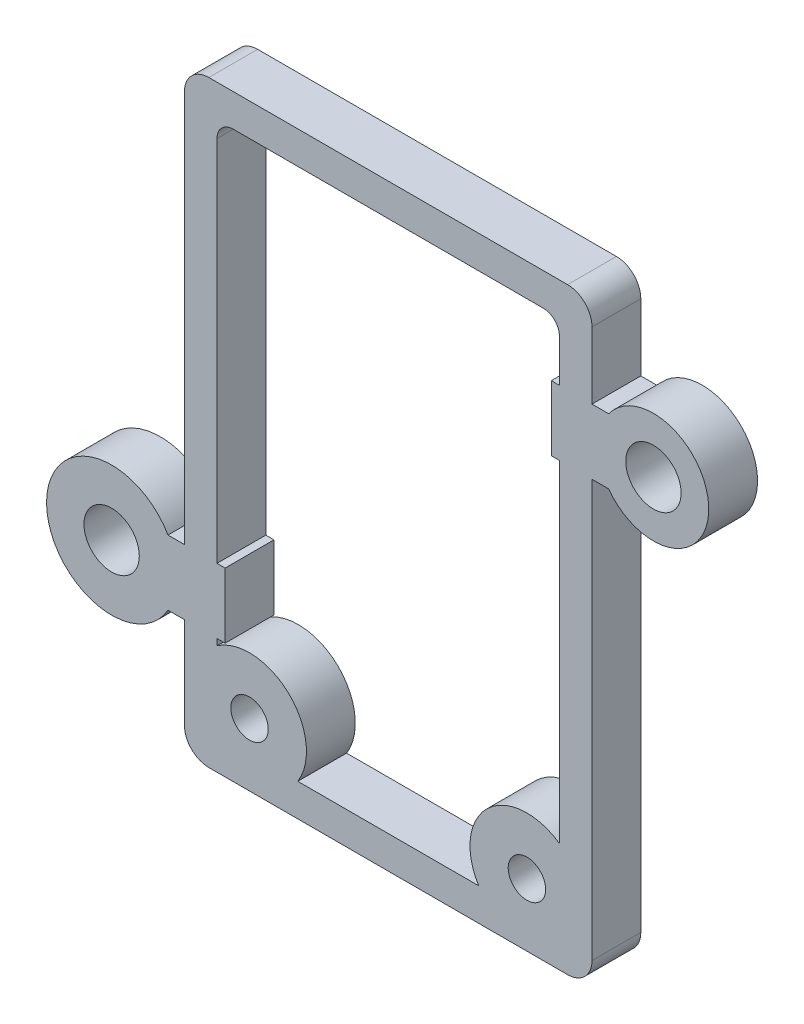
ISO-10303-21;
HEADER;
FILE_DESCRIPTION(('STEP AP214'),'2;1');
FILE_NAME('part.step','',(''),(''),'','','');
FILE_SCHEMA(('AUTOMOTIVE_DESIGN { 1 0 10303 214 1 1 1 1 }'));
ENDSEC;
DATA;
#1=APPLICATION_CONTEXT('core data for automotive mechanical design processes');
#2=APPLICATION_PROTOCOL_DEFINITION('international standard','automotive_design',2000,#1);
#3=PRODUCT_CONTEXT('',#1,'mechanical');
#4=PRODUCT('Part','Part','',(#3));
#5=PRODUCT_RELATED_PRODUCT_CATEGORY('part','',(#4));
#6=PRODUCT_DEFINITION_FORMATION('','',#4);
#7=PRODUCT_DEFINITION_CONTEXT('part definition',#1,'design');
#8=PRODUCT_DEFINITION('design','',#6,#7);
#9=PRODUCT_DEFINITION_SHAPE('','',#8);
#10=(LENGTH_UNIT() NAMED_UNIT(*) SI_UNIT(.MILLI.,.METRE.));
#11=(NAMED_UNIT(*) PLANE_ANGLE_UNIT() SI_UNIT($,.RADIAN.));
#12=(NAMED_UNIT(*) SI_UNIT($,.STERADIAN.) SOLID_ANGLE_UNIT());
#13=UNCERTAINTY_MEASURE_WITH_UNIT(LENGTH_MEASURE(1.E-05),#10,'distance_accuracy_value','');
#14=(GEOMETRIC_REPRESENTATION_CONTEXT(3) GLOBAL_UNCERTAINTY_ASSIGNED_CONTEXT((#13)) GLOBAL_UNIT_ASSIGNED_CONTEXT((#10,
#11,#12)) REPRESENTATION_CONTEXT('',''));
#15=CARTESIAN_POINT('',(0.,0.,0.));
#16=DIRECTION('',(0.,0.,1.));
#17=DIRECTION('',(1.,0.,0.));
#18=AXIS2_PLACEMENT_3D('',#15,#16,#17);
#19=CARTESIAN_POINT('',(-4.975,6.62,3.));
#20=DIRECTION('',(0.,1.,0.));
#21=DIRECTION('',(0.,0.,1.));
#22=AXIS2_PLACEMENT_3D('',#19,#20,#21);
#23=PLANE('',#22);
#24=DIRECTION('',(0.,0.,-1.));
#25=VECTOR('',#24,1.);
#26=CARTESIAN_POINT('',(-1.51089838486224,6.62,3.));
#27=LINE('',#26,#25);
#28=CARTESIAN_POINT('',(-1.51089838486224,6.62,0.));
#29=VERTEX_POINT('',#28);
#30=CARTESIAN_POINT('',(-1.51089838486224,6.62,3.));
#31=VERTEX_POINT('',#30);
#32=EDGE_CURVE('E61',#29,#31,#27,.F.);
#33=ORIENTED_EDGE('',*,*,#32,.F.);
#34=DIRECTION('',(1.,0.,0.));
#35=VECTOR('',#34,1.);
#36=CARTESIAN_POINT('',(-4.975,6.62,0.));
#37=LINE('',#36,#35);
#38=CARTESIAN_POINT('',(-0.5,6.62,0.));
#39=VERTEX_POINT('',#38);
#40=EDGE_CURVE('E298',#29,#39,#37,.T.);
#41=ORIENTED_EDGE('',*,*,#40,.T.);
#42=DIRECTION('',(0.,0.,1.));
#43=VECTOR('',#42,1.);
#44=CARTESIAN_POINT('',(-0.5,6.62,3.));
#45=LINE('',#44,#43);
#46=CARTESIAN_POINT('',(-0.5,6.62,3.));
#47=VERTEX_POINT('',#46);
#48=EDGE_CURVE('E479',#39,#47,#45,.T.);
#49=ORIENTED_EDGE('',*,*,#48,.T.);
#50=DIRECTION('',(1.,0.,0.));
#51=VECTOR('',#50,1.);
#52=CARTESIAN_POINT('',(-4.975,6.62,3.));
#53=LINE('',#52,#51);
#54=EDGE_CURVE('E59',#31,#47,#53,.T.);
#55=ORIENTED_EDGE('',*,*,#54,.F.);
#56=EDGE_LOOP('',(#33,#41,#49,#55));
#57=FACE_BOUND('',#56,.T.);
#58=ADVANCED_FACE('F43',(#57),#23,.F.);
#59=CARTESIAN_POINT('',(2.,10.62,3.));
#60=DIRECTION('',(0.,-1.,0.));
#61=DIRECTION('',(0.,0.,-1.));
#62=AXIS2_PLACEMENT_3D('',#59,#60,#61);
#63=PLANE('',#62);
#64=DIRECTION('',(0.,0.,-1.));
#65=VECTOR('',#64,1.);
#66=CARTESIAN_POINT('',(-1.51089838486225,10.62,3.));
#67=LINE('',#66,#65);
#68=CARTESIAN_POINT('',(-1.51089838486225,10.62,3.));
#69=VERTEX_POINT('',#68);
#70=CARTESIAN_POINT('',(-1.51089838486225,10.62,0.));
#71=VERTEX_POINT('',#70);
#72=EDGE_CURVE('E11',#69,#71,#67,.T.);
#73=ORIENTED_EDGE('',*,*,#72,.F.);
#74=DIRECTION('',(-1.,0.,0.));
#75=VECTOR('',#74,1.);
#76=CARTESIAN_POINT('',(2.,10.62,3.));
#77=LINE('',#76,#75);
#78=CARTESIAN_POINT('',(-0.5,10.62,3.));
#79=VERTEX_POINT('',#78);
#80=EDGE_CURVE('E293',#79,#69,#77,.T.);
#81=ORIENTED_EDGE('',*,*,#80,.F.);
#82=DIRECTION('',(0.,0.,-1.));
#83=VECTOR('',#82,1.);
#84=CARTESIAN_POINT('',(-0.5,10.62,3.));
#85=LINE('',#84,#83);
#86=CARTESIAN_POINT('',(-0.5,10.62,0.));
#87=VERTEX_POINT('',#86);
#88=EDGE_CURVE('E472',#79,#87,#85,.T.);
#89=ORIENTED_EDGE('',*,*,#88,.T.);
#90=DIRECTION('',(-1.,0.,0.));
#91=VECTOR('',#90,1.);
#92=CARTESIAN_POINT('',(2.,10.62,0.));
#93=LINE('',#92,#91);
#94=EDGE_CURVE('E301',#87,#71,#93,.T.);
#95=ORIENTED_EDGE('',*,*,#94,.T.);
#96=EDGE_LOOP('',(#73,#81,#89,#95));
#97=FACE_BOUND('',#96,.T.);
#98=ADVANCED_FACE('F530',(#97),#63,.F.);
#99=CARTESIAN_POINT('',(28.025,30.62,3.));
#100=DIRECTION('',(0.,-1.,0.));
#101=DIRECTION('',(0.,0.,-1.));
#102=AXIS2_PLACEMENT_3D('',#99,#100,#101);
#103=PLANE('',#102);
#104=DIRECTION('',(0.,0.,-1.));
#105=VECTOR('',#104,1.);
#106=CARTESIAN_POINT('',(25.5754545830265,30.62,3.));
#107=LINE('',#106,#105);
#108=CARTESIAN_POINT('',(25.5754545830265,30.62,0.));
#109=VERTEX_POINT('',#108);
#110=CARTESIAN_POINT('',(25.5754545830265,30.62,3.));
#111=VERTEX_POINT('',#110);
#112=EDGE_CURVE('E284',#109,#111,#107,.F.);
#113=ORIENTED_EDGE('',*,*,#112,.F.);
#114=DIRECTION('',(-1.,0.,0.));
#115=VECTOR('',#114,1.);
#116=CARTESIAN_POINT('',(28.025,30.62,0.));
#117=LINE('',#116,#115);
#118=CARTESIAN_POINT('',(24.55,30.62,0.));
#119=VERTEX_POINT('',#118);
#120=EDGE_CURVE('E257',#109,#119,#117,.T.);
#121=ORIENTED_EDGE('',*,*,#120,.T.);
#122=DIRECTION('',(0.,0.,1.));
#123=VECTOR('',#122,1.);
#124=CARTESIAN_POINT('',(24.55,30.62,3.));
#125=LINE('',#124,#123);
#126=CARTESIAN_POINT('',(24.55,30.62,3.));
#127=VERTEX_POINT('',#126);
#128=EDGE_CURVE('E480',#119,#127,#125,.T.);
#129=ORIENTED_EDGE('',*,*,#128,.T.);
#130=DIRECTION('',(-1.,0.,0.));
#131=VECTOR('',#130,1.);
#132=CARTESIAN_POINT('',(28.025,30.62,3.));
#133=LINE('',#132,#131);
#134=EDGE_CURVE('E324',#111,#127,#133,.T.);
#135=ORIENTED_EDGE('',*,*,#134,.F.);
#136=EDGE_LOOP('',(#113,#121,#129,#135));
#137=FACE_BOUND('',#136,.T.);
#138=ADVANCED_FACE('F485',(#137),#103,.F.);
#139=CARTESIAN_POINT('',(22.05,26.62,3.));
#140=DIRECTION('',(0.,1.,0.));
#141=DIRECTION('',(0.,0.,1.));
#142=AXIS2_PLACEMENT_3D('',#139,#140,#141);
#143=PLANE('',#142);
#144=DIRECTION('',(0.,0.,-1.));
#145=VECTOR('',#144,1.);
#146=CARTESIAN_POINT('',(25.5754545830265,26.62,3.));
#147=LINE('',#146,#145);
#148=CARTESIAN_POINT('',(25.5754545830265,26.62,3.));
#149=VERTEX_POINT('',#148);
#150=CARTESIAN_POINT('',(25.5754545830265,26.62,0.));
#151=VERTEX_POINT('',#150);
#152=EDGE_CURVE('E51',#149,#151,#147,.T.);
#153=ORIENTED_EDGE('',*,*,#152,.F.);
#154=DIRECTION('',(1.,0.,0.));
#155=VECTOR('',#154,1.);
#156=CARTESIAN_POINT('',(22.05,26.62,3.));
#157=LINE('',#156,#155);
#158=CARTESIAN_POINT('',(24.55,26.62,3.));
#159=VERTEX_POINT('',#158);
#160=EDGE_CURVE('E325',#159,#149,#157,.T.);
#161=ORIENTED_EDGE('',*,*,#160,.F.);
#162=DIRECTION('',(0.,0.,-1.));
#163=VECTOR('',#162,1.);
#164=CARTESIAN_POINT('',(24.55,26.62,3.));
#165=LINE('',#164,#163);
#166=CARTESIAN_POINT('',(24.55,26.62,0.));
#167=VERTEX_POINT('',#166);
#168=EDGE_CURVE('E253',#159,#167,#165,.T.);
#169=ORIENTED_EDGE('',*,*,#168,.T.);
#170=DIRECTION('',(1.,0.,0.));
#171=VECTOR('',#170,1.);
#172=CARTESIAN_POINT('',(22.05,26.62,0.));
#173=LINE('',#172,#171);
#174=EDGE_CURVE('E249',#167,#151,#173,.T.);
#175=ORIENTED_EDGE('',*,*,#174,.T.);
#176=EDGE_LOOP('',(#153,#161,#169,#175));
#177=FACE_BOUND('',#176,.T.);
#178=ADVANCED_FACE('F255',(#177),#143,.F.);
#179=CARTESIAN_POINT('',(22.55,2.5,3.));
#180=DIRECTION('',(-1.,0.,0.));
#181=DIRECTION('',(0.,0.,1.));
#182=AXIS2_PLACEMENT_3D('',#179,#180,#181);
#183=PLANE('',#182);
#184=DIRECTION('',(0.,1.,0.));
#185=VECTOR('',#184,1.);
#186=CARTESIAN_POINT('',(22.55,2.5,3.));
#187=LINE('',#186,#185);
#188=CARTESIAN_POINT('',(22.55,6.23228132326901,3.));
#189=VERTEX_POINT('',#188);
#190=CARTESIAN_POINT('',(22.55,26.62,3.));
#191=VERTEX_POINT('',#190);
#192=EDGE_CURVE('E364',#189,#191,#187,.T.);
#193=ORIENTED_EDGE('',*,*,#192,.T.);
#194=DIRECTION('',(0.,0.,-1.));
#195=VECTOR('',#194,1.);
#196=CARTESIAN_POINT('',(22.55,26.62,3.));
#197=LINE('',#196,#195);
#198=CARTESIAN_POINT('',(22.55,26.62,0.));
#199=VERTEX_POINT('',#198);
#200=EDGE_CURVE('E336',#191,#199,#197,.T.);
#201=ORIENTED_EDGE('',*,*,#200,.T.);
#202=DIRECTION('',(0.,1.,0.));
#203=VECTOR('',#202,1.);
#204=CARTESIAN_POINT('',(22.55,2.5,0.));
#205=LINE('',#204,#203);
#206=CARTESIAN_POINT('',(22.55,6.23228132326901,0.));
#207=VERTEX_POINT('',#206);
#208=EDGE_CURVE('E385',#207,#199,#205,.T.);
#209=ORIENTED_EDGE('',*,*,#208,.F.);
#210=DIRECTION('',(0.,0.,-1.));
#211=VECTOR('',#210,1.);
#212=CARTESIAN_POINT('',(22.55,6.23228132326901,3.));
#213=LINE('',#212,#211);
#214=EDGE_CURVE('E471',#207,#189,#213,.F.);
#215=ORIENTED_EDGE('',*,*,#214,.T.);
#216=EDGE_LOOP('',(#193,#201,#209,#215));
#217=FACE_BOUND('',#216,.T.);
#218=ADVANCED_FACE('F573',(#217),#183,.T.);
#219=CARTESIAN_POINT('',(22.55,30.62,0.));
#220=VERTEX_POINT('',#219);
#221=CARTESIAN_POINT('',(22.55,33.23,0.));
#222=VERTEX_POINT('',#221);
#223=EDGE_CURVE('E382',#220,#222,#205,.T.);
#224=ORIENTED_EDGE('',*,*,#223,.F.);
#225=DIRECTION('',(0.,0.,1.));
#226=VECTOR('',#225,1.);
#227=CARTESIAN_POINT('',(22.55,30.62,3.));
#228=LINE('',#227,#226);
#229=CARTESIAN_POINT('',(22.55,30.62,3.));
#230=VERTEX_POINT('',#229);
#231=EDGE_CURVE('E335',#220,#230,#228,.T.);
#232=ORIENTED_EDGE('',*,*,#231,.T.);
#233=CARTESIAN_POINT('',(22.55,33.23,3.));
#234=VERTEX_POINT('',#233);
#235=EDGE_CURVE('E365',#230,#234,#187,.T.);
#236=ORIENTED_EDGE('',*,*,#235,.T.);
#237=DIRECTION('',(0.,0.,-1.));
#238=VECTOR('',#237,1.);
#239=CARTESIAN_POINT('',(22.55,33.23,3.));
#240=LINE('',#239,#238);
#241=EDGE_CURVE('E405',#234,#222,#240,.T.);
#242=ORIENTED_EDGE('',*,*,#241,.T.);
#243=EDGE_LOOP('',(#224,#232,#236,#242));
#244=FACE_BOUND('',#243,.T.);
#245=ADVANCED_FACE('F589',(#244),#183,.T.);
#246=CARTESIAN_POINT('',(1.5,33.23,3.));
#247=DIRECTION('',(1.,0.,0.));
#248=DIRECTION('',(0.,0.,-1.));
#249=AXIS2_PLACEMENT_3D('',#246,#247,#248);
#250=PLANE('',#249);
#251=DIRECTION('',(0.,-1.,0.));
#252=VECTOR('',#251,1.);
#253=CARTESIAN_POINT('',(1.5,33.23,0.));
#254=LINE('',#253,#252);
#255=CARTESIAN_POINT('',(1.5,6.62,0.));
#256=VERTEX_POINT('',#255);
#257=CARTESIAN_POINT('',(1.5,6.23228132326901,0.));
#258=VERTEX_POINT('',#257);
#259=EDGE_CURVE('E393',#256,#258,#254,.T.);
#260=ORIENTED_EDGE('',*,*,#259,.F.);
#261=DIRECTION('',(0.,0.,1.));
#262=VECTOR('',#261,1.);
#263=CARTESIAN_POINT('',(1.5,6.62,3.));
#264=LINE('',#263,#262);
#265=CARTESIAN_POINT('',(1.5,6.62,3.));
#266=VERTEX_POINT('',#265);
#267=EDGE_CURVE('E332',#256,#266,#264,.T.);
#268=ORIENTED_EDGE('',*,*,#267,.T.);
#269=DIRECTION('',(0.,-1.,0.));
#270=VECTOR('',#269,1.);
#271=CARTESIAN_POINT('',(1.5,33.23,3.));
#272=LINE('',#271,#270);
#273=CARTESIAN_POINT('',(1.5,6.23228132326901,3.));
#274=VERTEX_POINT('',#273);
#275=EDGE_CURVE('E372',#266,#274,#272,.T.);
#276=ORIENTED_EDGE('',*,*,#275,.T.);
#277=DIRECTION('',(0.,0.,-1.));
#278=VECTOR('',#277,1.);
#279=CARTESIAN_POINT('',(1.5,6.23228132326901,3.));
#280=LINE('',#279,#278);
#281=EDGE_CURVE('E469',#274,#258,#280,.T.);
#282=ORIENTED_EDGE('',*,*,#281,.T.);
#283=EDGE_LOOP('',(#260,#268,#276,#282));
#284=FACE_BOUND('',#283,.T.);
#285=ADVANCED_FACE('F563',(#284),#250,.T.);
#286=CARTESIAN_POINT('',(1.5,33.23,3.));
#287=VERTEX_POINT('',#286);
#288=CARTESIAN_POINT('',(1.5,10.62,3.));
#289=VERTEX_POINT('',#288);
#290=EDGE_CURVE('E374',#287,#289,#272,.T.);
#291=ORIENTED_EDGE('',*,*,#290,.T.);
#292=DIRECTION('',(0.,0.,-1.));
#293=VECTOR('',#292,1.);
#294=CARTESIAN_POINT('',(1.5,10.62,3.));
#295=LINE('',#294,#293);
#296=CARTESIAN_POINT('',(1.5,10.62,0.));
#297=VERTEX_POINT('',#296);
#298=EDGE_CURVE('E307',#289,#297,#295,.T.);
#299=ORIENTED_EDGE('',*,*,#298,.T.);
#300=CARTESIAN_POINT('',(1.5,33.23,0.));
#301=VERTEX_POINT('',#300);
#302=EDGE_CURVE('E361',#301,#297,#254,.T.);
#303=ORIENTED_EDGE('',*,*,#302,.F.);
#304=DIRECTION('',(0.,0.,-1.));
#305=VECTOR('',#304,1.);
#306=CARTESIAN_POINT('',(1.5,33.23,3.));
#307=LINE('',#306,#305);
#308=EDGE_CURVE('E377',#287,#301,#307,.T.);
#309=ORIENTED_EDGE('',*,*,#308,.F.);
#310=EDGE_LOOP('',(#291,#299,#303,#309));
#311=FACE_BOUND('',#310,.T.);
#312=ADVANCED_FACE('F607',(#311),#250,.T.);
#313=CARTESIAN_POINT('',(24.55,1.,3.));
#314=DIRECTION('',(-1.,0.,0.));
#315=DIRECTION('',(0.,0.,1.));
#316=AXIS2_PLACEMENT_3D('',#313,#314,#315);
#317=PLANE('',#316);
#318=ORIENTED_EDGE('',*,*,#168,.F.);
#319=DIRECTION('',(0.,1.,0.));
#320=VECTOR('',#319,1.);
#321=CARTESIAN_POINT('',(24.55,1.,3.));
#322=LINE('',#321,#320);
#323=CARTESIAN_POINT('',(24.55,1.,3.));
#324=VERTEX_POINT('',#323);
#325=EDGE_CURVE('E415',#324,#159,#322,.T.);
#326=ORIENTED_EDGE('',*,*,#325,.F.);
#327=DIRECTION('',(0.,0.,-1.));
#328=VECTOR('',#327,1.);
#329=CARTESIAN_POINT('',(24.55,1.,3.));
#330=LINE('',#329,#328);
#331=CARTESIAN_POINT('',(24.55,1.,0.));
#332=VERTEX_POINT('',#331);
#333=EDGE_CURVE('E460',#324,#332,#330,.T.);
#334=ORIENTED_EDGE('',*,*,#333,.T.);
#335=DIRECTION('',(0.,1.,0.));
#336=VECTOR('',#335,1.);
#337=CARTESIAN_POINT('',(24.55,1.,0.));
#338=LINE('',#337,#336);
#339=EDGE_CURVE('E436',#332,#167,#338,.T.);
#340=ORIENTED_EDGE('',*,*,#339,.T.);
#341=EDGE_LOOP('',(#318,#326,#334,#340));
#342=FACE_BOUND('',#341,.T.);
#343=ADVANCED_FACE('F512',(#342),#317,.F.);
#344=ORIENTED_EDGE('',*,*,#128,.F.);
#345=CARTESIAN_POINT('',(24.55,34.73,0.));
#346=VERTEX_POINT('',#345);
#347=EDGE_CURVE('E434',#119,#346,#338,.T.);
#348=ORIENTED_EDGE('',*,*,#347,.T.);
#349=DIRECTION('',(0.,0.,-1.));
#350=VECTOR('',#349,1.);
#351=CARTESIAN_POINT('',(24.55,34.73,3.));
#352=LINE('',#351,#350);
#353=CARTESIAN_POINT('',(24.55,34.73,3.));
#354=VERTEX_POINT('',#353);
#355=EDGE_CURVE('E457',#354,#346,#352,.T.);
#356=ORIENTED_EDGE('',*,*,#355,.F.);
#357=EDGE_CURVE('E413',#127,#354,#322,.T.);
#358=ORIENTED_EDGE('',*,*,#357,.F.);
#359=EDGE_LOOP('',(#344,#348,#356,#358));
#360=FACE_BOUND('',#359,.T.);
#361=ADVANCED_FACE('F486',(#360),#317,.F.);
#362=CARTESIAN_POINT('',(-0.5,34.73,3.));
#363=DIRECTION('',(1.,0.,0.));
#364=DIRECTION('',(0.,0.,-1.));
#365=AXIS2_PLACEMENT_3D('',#362,#363,#364);
#366=PLANE('',#365);
#367=ORIENTED_EDGE('',*,*,#48,.F.);
#368=DIRECTION('',(0.,-1.,0.));
#369=VECTOR('',#368,1.);
#370=CARTESIAN_POINT('',(-0.5,34.73,0.));
#371=LINE('',#370,#369);
#372=CARTESIAN_POINT('',(-0.5,1.,0.));
#373=VERTEX_POINT('',#372);
#374=EDGE_CURVE('E443',#39,#373,#371,.T.);
#375=ORIENTED_EDGE('',*,*,#374,.T.);
#376=DIRECTION('',(0.,0.,-1.));
#377=VECTOR('',#376,1.);
#378=CARTESIAN_POINT('',(-0.5,1.,3.));
#379=LINE('',#378,#377);
#380=CARTESIAN_POINT('',(-0.5,1.,3.));
#381=VERTEX_POINT('',#380);
#382=EDGE_CURVE('E426',#381,#373,#379,.T.);
#383=ORIENTED_EDGE('',*,*,#382,.F.);
#384=DIRECTION('',(0.,-1.,0.));
#385=VECTOR('',#384,1.);
#386=CARTESIAN_POINT('',(-0.5,34.73,3.));
#387=LINE('',#386,#385);
#388=EDGE_CURVE('E425',#47,#381,#387,.T.);
#389=ORIENTED_EDGE('',*,*,#388,.F.);
#390=EDGE_LOOP('',(#367,#375,#383,#389));
#391=FACE_BOUND('',#390,.T.);
#392=ADVANCED_FACE('F527',(#391),#366,.F.);
#393=ORIENTED_EDGE('',*,*,#88,.F.);
#394=CARTESIAN_POINT('',(-0.499999999999999,34.73,3.));
#395=VERTEX_POINT('',#394);
#396=EDGE_CURVE('E424',#395,#79,#387,.T.);
#397=ORIENTED_EDGE('',*,*,#396,.F.);
#398=DIRECTION('',(0.,0.,-1.));
#399=VECTOR('',#398,1.);
#400=CARTESIAN_POINT('',(-0.499999999999999,34.73,3.));
#401=LINE('',#400,#399);
#402=CARTESIAN_POINT('',(-0.499999999999999,34.73,0.));
#403=VERTEX_POINT('',#402);
#404=EDGE_CURVE('E449',#395,#403,#401,.T.);
#405=ORIENTED_EDGE('',*,*,#404,.T.);
#406=EDGE_CURVE('E407',#403,#87,#371,.T.);
#407=ORIENTED_EDGE('',*,*,#406,.T.);
#408=EDGE_LOOP('',(#393,#397,#405,#407));
#409=FACE_BOUND('',#408,.T.);
#410=ADVANCED_FACE('F675',(#409),#366,.F.);
#411=CARTESIAN_POINT('',(2.5,1.5,3.));
#412=DIRECTION('',(0.,1.,0.));
#413=DIRECTION('',(0.,0.,1.));
#414=AXIS2_PLACEMENT_3D('',#411,#412,#413);
#415=PLANE('',#414);
#416=DIRECTION('',(1.,0.,0.));
#417=VECTOR('',#416,1.);
#418=CARTESIAN_POINT('',(2.5,1.5,0.));
#419=LINE('',#418,#417);
#420=CARTESIAN_POINT('',(6.46486087363303,1.5,0.));
#421=VERTEX_POINT('',#420);
#422=CARTESIAN_POINT('',(17.585139126367,1.5,0.));
#423=VERTEX_POINT('',#422);
#424=EDGE_CURVE('E356',#421,#423,#419,.T.);
#425=ORIENTED_EDGE('',*,*,#424,.F.);
#426=DIRECTION('',(0.,0.,-1.));
#427=VECTOR('',#426,1.);
#428=CARTESIAN_POINT('',(6.46486087363303,1.5,3.));
#429=LINE('',#428,#427);
#430=CARTESIAN_POINT('',(6.46486087363303,1.5,3.));
#431=VERTEX_POINT('',#430);
#432=EDGE_CURVE('E342',#421,#431,#429,.F.);
#433=ORIENTED_EDGE('',*,*,#432,.T.);
#434=DIRECTION('',(1.,0.,0.));
#435=VECTOR('',#434,1.);
#436=CARTESIAN_POINT('',(2.5,1.5,3.));
#437=LINE('',#436,#435);
#438=CARTESIAN_POINT('',(17.585139126367,1.5,3.));
#439=VERTEX_POINT('',#438);
#440=EDGE_CURVE('E360',#431,#439,#437,.T.);
#441=ORIENTED_EDGE('',*,*,#440,.T.);
#442=DIRECTION('',(0.,0.,-1.));
#443=VECTOR('',#442,1.);
#444=CARTESIAN_POINT('',(17.585139126367,1.5,3.));
#445=LINE('',#444,#443);
#446=EDGE_CURVE('E355',#439,#423,#445,.T.);
#447=ORIENTED_EDGE('',*,*,#446,.T.);
#448=EDGE_LOOP('',(#425,#433,#441,#447));
#449=FACE_BOUND('',#448,.T.);
#450=ADVANCED_FACE('F569',(#449),#415,.T.);
#451=CARTESIAN_POINT('',(1.,1.,3.));
#452=DIRECTION('',(0.,0.,1.));
#453=DIRECTION('',(1.,0.,0.));
#454=AXIS2_PLACEMENT_3D('',#451,#452,#453);
#455=PLANE('',#454);
#456=CARTESIAN_POINT('',(-4.975,8.62,3.));
#457=DIRECTION('',(0.,0.,1.));
#458=DIRECTION('',(1.,0.,0.));
#459=AXIS2_PLACEMENT_3D('',#456,#457,#458);
#460=CIRCLE('',#459,1.7);
#461=CARTESIAN_POINT('',(-3.275,8.62,3.));
#462=VERTEX_POINT('',#461);
#463=EDGE_CURVE('E641',#462,#462,#460,.F.);
#464=ORIENTED_EDGE('',*,*,#463,.T.);
#465=EDGE_LOOP('',(#464));
#466=FACE_BOUND('',#465,.T.);
#467=CARTESIAN_POINT('',(28.325,28.62,3.));
#468=DIRECTION('',(0.,0.,1.));
#469=DIRECTION('',(1.,0.,0.));
#470=AXIS2_PLACEMENT_3D('',#467,#468,#469);
#471=CIRCLE('',#470,1.7);
#472=CARTESIAN_POINT('',(30.025,28.62,3.));
#473=VERTEX_POINT('',#472);
#474=EDGE_CURVE('E648',#473,#473,#471,.F.);
#475=ORIENTED_EDGE('',*,*,#474,.T.);
#476=EDGE_LOOP('',(#475));
#477=FACE_BOUND('',#476,.T.);
#478=CARTESIAN_POINT('',(3.5,3.36,3.));
#479=DIRECTION('',(0.,0.,1.));
#480=DIRECTION('',(1.,0.,0.));
#481=AXIS2_PLACEMENT_3D('',#478,#479,#480);
#482=CIRCLE('',#481,1.15);
#483=CARTESIAN_POINT('',(4.65,3.36,3.));
#484=VERTEX_POINT('',#483);
#485=EDGE_CURVE('E278',#484,#484,#482,.F.);
#486=ORIENTED_EDGE('',*,*,#485,.T.);
#487=EDGE_LOOP('',(#486));
#488=FACE_BOUND('',#487,.T.);
#489=CARTESIAN_POINT('',(20.55,3.36,3.));
#490=DIRECTION('',(0.,0.,1.));
#491=DIRECTION('',(1.,0.,0.));
#492=AXIS2_PLACEMENT_3D('',#489,#490,#491);
#493=CIRCLE('',#492,1.15);
#494=CARTESIAN_POINT('',(21.7,3.36,3.));
#495=VERTEX_POINT('',#494);
#496=EDGE_CURVE('E665',#495,#495,#493,.F.);
#497=ORIENTED_EDGE('',*,*,#496,.T.);
#498=EDGE_LOOP('',(#497));
#499=FACE_BOUND('',#498,.T.);
#500=CARTESIAN_POINT('',(-4.975,8.62,3.));
#501=DIRECTION('',(0.,0.,1.));
#502=DIRECTION('',(1.,0.,0.));
#503=AXIS2_PLACEMENT_3D('',#500,#501,#502);
#504=CIRCLE('',#503,4.);
#505=EDGE_CURVE('E276',#69,#31,#504,.T.);
#506=ORIENTED_EDGE('',*,*,#505,.T.);
#507=ORIENTED_EDGE('',*,*,#54,.T.);
#508=ORIENTED_EDGE('',*,*,#388,.T.);
#509=CARTESIAN_POINT('',(1.,1.,3.));
#510=DIRECTION('',(0.,0.,1.));
#511=DIRECTION('',(1.,0.,0.));
#512=AXIS2_PLACEMENT_3D('',#509,#510,#511);
#513=CIRCLE('',#512,1.5);
#514=CARTESIAN_POINT('',(1.,-0.5,3.));
#515=VERTEX_POINT('',#514);
#516=EDGE_CURVE('E409',#381,#515,#513,.T.);
#517=ORIENTED_EDGE('',*,*,#516,.T.);
#518=DIRECTION('',(1.,0.,0.));
#519=VECTOR('',#518,1.);
#520=CARTESIAN_POINT('',(1.,-0.5,3.));
#521=LINE('',#520,#519);
#522=CARTESIAN_POINT('',(23.05,-0.5,3.));
#523=VERTEX_POINT('',#522);
#524=EDGE_CURVE('E408',#515,#523,#521,.T.);
#525=ORIENTED_EDGE('',*,*,#524,.T.);
#526=CARTESIAN_POINT('',(23.05,1.,3.));
#527=DIRECTION('',(0.,0.,1.));
#528=DIRECTION('',(1.,0.,0.));
#529=AXIS2_PLACEMENT_3D('',#526,#527,#528);
#530=CIRCLE('',#529,1.5);
#531=EDGE_CURVE('E412',#523,#324,#530,.T.);
#532=ORIENTED_EDGE('',*,*,#531,.T.);
#533=ORIENTED_EDGE('',*,*,#325,.T.);
#534=ORIENTED_EDGE('',*,*,#160,.T.);
#535=CARTESIAN_POINT('',(28.325,28.62,3.));
#536=DIRECTION('',(0.,0.,1.));
#537=DIRECTION('',(1.,0.,0.));
#538=AXIS2_PLACEMENT_3D('',#535,#536,#537);
#539=CIRCLE('',#538,3.4);
#540=EDGE_CURVE('E268',#149,#111,#539,.T.);
#541=ORIENTED_EDGE('',*,*,#540,.T.);
#542=ORIENTED_EDGE('',*,*,#134,.T.);
#543=ORIENTED_EDGE('',*,*,#357,.T.);
#544=CARTESIAN_POINT('',(23.05,34.73,3.));
#545=DIRECTION('',(0.,0.,1.));
#546=DIRECTION('',(1.,0.,0.));
#547=AXIS2_PLACEMENT_3D('',#544,#545,#546);
#548=CIRCLE('',#547,1.5);
#549=CARTESIAN_POINT('',(23.05,36.23,3.));
#550=VERTEX_POINT('',#549);
#551=EDGE_CURVE('E419',#354,#550,#548,.T.);
#552=ORIENTED_EDGE('',*,*,#551,.T.);
#553=DIRECTION('',(-1.,0.,0.));
#554=VECTOR('',#553,1.);
#555=CARTESIAN_POINT('',(23.05,36.23,3.));
#556=LINE('',#555,#554);
#557=CARTESIAN_POINT('',(1.,36.23,3.));
#558=VERTEX_POINT('',#557);
#559=EDGE_CURVE('E420',#550,#558,#556,.T.);
#560=ORIENTED_EDGE('',*,*,#559,.T.);
#561=CARTESIAN_POINT('',(0.999999999999997,34.73,3.));
#562=DIRECTION('',(0.,0.,1.));
#563=DIRECTION('',(1.,0.,0.));
#564=AXIS2_PLACEMENT_3D('',#561,#562,#563);
#565=CIRCLE('',#564,1.5);
#566=EDGE_CURVE('E422',#558,#395,#565,.T.);
#567=ORIENTED_EDGE('',*,*,#566,.T.);
#568=ORIENTED_EDGE('',*,*,#396,.T.);
#569=ORIENTED_EDGE('',*,*,#80,.T.);
#570=EDGE_LOOP('',(#506,#507,#508,#517,#525,#532,#533,#534,#541,#542,#543,#552,#560,#567,#568,#569));
#571=FACE_BOUND('',#570,.T.);
#572=ORIENTED_EDGE('',*,*,#275,.F.);
#573=CARTESIAN_POINT('',(2.,6.62,3.));
#574=VERTEX_POINT('',#573);
#575=EDGE_CURVE('E288',#266,#574,#53,.T.);
#576=ORIENTED_EDGE('',*,*,#575,.T.);
#577=DIRECTION('',(0.,1.,0.));
#578=VECTOR('',#577,1.);
#579=CARTESIAN_POINT('',(2.,6.62,3.));
#580=LINE('',#579,#578);
#581=CARTESIAN_POINT('',(2.,10.62,3.));
#582=VERTEX_POINT('',#581);
#583=EDGE_CURVE('E289',#574,#582,#580,.T.);
#584=ORIENTED_EDGE('',*,*,#583,.T.);
#585=EDGE_CURVE('E292',#582,#289,#77,.T.);
#586=ORIENTED_EDGE('',*,*,#585,.T.);
#587=ORIENTED_EDGE('',*,*,#290,.F.);
#588=CARTESIAN_POINT('',(2.50000000000001,33.23,3.));
#589=DIRECTION('',(0.,0.,1.));
#590=DIRECTION('',(1.,0.,0.));
#591=AXIS2_PLACEMENT_3D('',#588,#589,#590);
#592=CIRCLE('',#591,1.00000000000001);
#593=CARTESIAN_POINT('',(2.5,34.23,3.));
#594=VERTEX_POINT('',#593);
#595=EDGE_CURVE('E371',#594,#287,#592,.T.);
#596=ORIENTED_EDGE('',*,*,#595,.F.);
#597=DIRECTION('',(-1.,0.,0.));
#598=VECTOR('',#597,1.);
#599=CARTESIAN_POINT('',(21.55,34.23,3.));
#600=LINE('',#599,#598);
#601=CARTESIAN_POINT('',(21.55,34.23,3.));
#602=VERTEX_POINT('',#601);
#603=EDGE_CURVE('E367',#602,#594,#600,.T.);
#604=ORIENTED_EDGE('',*,*,#603,.F.);
#605=CARTESIAN_POINT('',(21.55,33.23,3.));
#606=DIRECTION('',(0.,0.,1.));
#607=DIRECTION('',(1.,0.,0.));
#608=AXIS2_PLACEMENT_3D('',#605,#606,#607);
#609=CIRCLE('',#608,1.00000000000001);
#610=EDGE_CURVE('E370',#234,#602,#609,.T.);
#611=ORIENTED_EDGE('',*,*,#610,.F.);
#612=ORIENTED_EDGE('',*,*,#235,.F.);
#613=CARTESIAN_POINT('',(22.05,30.62,3.));
#614=VERTEX_POINT('',#613);
#615=EDGE_CURVE('E314',#230,#614,#133,.T.);
#616=ORIENTED_EDGE('',*,*,#615,.T.);
#617=DIRECTION('',(0.,-1.,0.));
#618=VECTOR('',#617,1.);
#619=CARTESIAN_POINT('',(22.05,30.62,3.));
#620=LINE('',#619,#618);
#621=CARTESIAN_POINT('',(22.05,26.62,3.));
#622=VERTEX_POINT('',#621);
#623=EDGE_CURVE('E327',#614,#622,#620,.T.);
#624=ORIENTED_EDGE('',*,*,#623,.T.);
#625=EDGE_CURVE('E323',#622,#191,#157,.T.);
#626=ORIENTED_EDGE('',*,*,#625,.T.);
#627=ORIENTED_EDGE('',*,*,#192,.F.);
#628=CARTESIAN_POINT('',(20.55,3.36,3.));
#629=DIRECTION('',(0.,0.,1.));
#630=DIRECTION('',(1.,0.,0.));
#631=AXIS2_PLACEMENT_3D('',#628,#629,#630);
#632=CIRCLE('',#631,3.5);
#633=EDGE_CURVE('E344',#189,#439,#632,.T.);
#634=ORIENTED_EDGE('',*,*,#633,.T.);
#635=ORIENTED_EDGE('',*,*,#440,.F.);
#636=CARTESIAN_POINT('',(3.5,3.36,3.));
#637=DIRECTION('',(0.,0.,1.));
#638=DIRECTION('',(1.,0.,0.));
#639=AXIS2_PLACEMENT_3D('',#636,#637,#638);
#640=CIRCLE('',#639,3.5);
#641=EDGE_CURVE('E341',#431,#274,#640,.T.);
#642=ORIENTED_EDGE('',*,*,#641,.T.);
#643=EDGE_LOOP('',(#572,#576,#584,#586,#587,#596,#604,#611,#612,#616,#624,#626,#627,#634,#635,#642));
#644=FACE_BOUND('',#643,.T.);
#645=ADVANCED_FACE('F502',(#466,#477,#488,#499,#571,#644),#455,.T.);
#646=CARTESIAN_POINT('',(1.,1.,0.));
#647=DIRECTION('',(0.,0.,1.));
#648=DIRECTION('',(1.,0.,0.));
#649=AXIS2_PLACEMENT_3D('',#646,#647,#648);
#650=PLANE('',#649);
#651=CARTESIAN_POINT('',(-4.975,8.62,0.));
#652=DIRECTION('',(0.,0.,1.));
#653=DIRECTION('',(1.,0.,0.));
#654=AXIS2_PLACEMENT_3D('',#651,#652,#653);
#655=CIRCLE('',#654,1.7);
#656=CARTESIAN_POINT('',(-3.275,8.62,0.));
#657=VERTEX_POINT('',#656);
#658=EDGE_CURVE('E646',#657,#657,#655,.T.);
#659=ORIENTED_EDGE('',*,*,#658,.T.);
#660=EDGE_LOOP('',(#659));
#661=FACE_BOUND('',#660,.T.);
#662=CARTESIAN_POINT('',(28.325,28.62,0.));
#663=DIRECTION('',(0.,0.,1.));
#664=DIRECTION('',(1.,0.,0.));
#665=AXIS2_PLACEMENT_3D('',#662,#663,#664);
#666=CIRCLE('',#665,1.7);
#667=CARTESIAN_POINT('',(30.025,28.62,0.));
#668=VERTEX_POINT('',#667);
#669=EDGE_CURVE('E647',#668,#668,#666,.T.);
#670=ORIENTED_EDGE('',*,*,#669,.T.);
#671=EDGE_LOOP('',(#670));
#672=FACE_BOUND('',#671,.T.);
#673=CARTESIAN_POINT('',(3.5,3.36,0.));
#674=DIRECTION('',(0.,0.,1.));
#675=DIRECTION('',(1.,0.,0.));
#676=AXIS2_PLACEMENT_3D('',#673,#674,#675);
#677=CIRCLE('',#676,1.15);
#678=CARTESIAN_POINT('',(4.65,3.36,0.));
#679=VERTEX_POINT('',#678);
#680=EDGE_CURVE('E658',#679,#679,#677,.T.);
#681=ORIENTED_EDGE('',*,*,#680,.T.);
#682=EDGE_LOOP('',(#681));
#683=FACE_BOUND('',#682,.T.);
#684=CARTESIAN_POINT('',(20.55,3.36,0.));
#685=DIRECTION('',(0.,0.,1.));
#686=DIRECTION('',(1.,0.,0.));
#687=AXIS2_PLACEMENT_3D('',#684,#685,#686);
#688=CIRCLE('',#687,1.15);
#689=CARTESIAN_POINT('',(21.7,3.36,0.));
#690=VERTEX_POINT('',#689);
#691=EDGE_CURVE('E659',#690,#690,#688,.T.);
#692=ORIENTED_EDGE('',*,*,#691,.T.);
#693=EDGE_LOOP('',(#692));
#694=FACE_BOUND('',#693,.T.);
#695=ORIENTED_EDGE('',*,*,#40,.F.);
#696=CARTESIAN_POINT('',(-4.975,8.62,0.));
#697=DIRECTION('',(0.,0.,1.));
#698=DIRECTION('',(1.,0.,0.));
#699=AXIS2_PLACEMENT_3D('',#696,#697,#698);
#700=CIRCLE('',#699,4.);
#701=EDGE_CURVE('E274',#71,#29,#700,.T.);
#702=ORIENTED_EDGE('',*,*,#701,.F.);
#703=ORIENTED_EDGE('',*,*,#94,.F.);
#704=ORIENTED_EDGE('',*,*,#406,.F.);
#705=CARTESIAN_POINT('',(0.999999999999997,34.73,0.));
#706=DIRECTION('',(0.,0.,1.));
#707=DIRECTION('',(1.,0.,0.));
#708=AXIS2_PLACEMENT_3D('',#705,#706,#707);
#709=CIRCLE('',#708,1.5);
#710=CARTESIAN_POINT('',(1.,36.23,0.));
#711=VERTEX_POINT('',#710);
#712=EDGE_CURVE('E445',#711,#403,#709,.T.);
#713=ORIENTED_EDGE('',*,*,#712,.F.);
#714=DIRECTION('',(-1.,0.,0.));
#715=VECTOR('',#714,1.);
#716=CARTESIAN_POINT('',(23.05,36.23,0.));
#717=LINE('',#716,#715);
#718=CARTESIAN_POINT('',(23.05,36.23,0.));
#719=VERTEX_POINT('',#718);
#720=EDGE_CURVE('E439',#719,#711,#717,.T.);
#721=ORIENTED_EDGE('',*,*,#720,.F.);
#722=CARTESIAN_POINT('',(23.05,34.73,0.));
#723=DIRECTION('',(0.,0.,1.));
#724=DIRECTION('',(1.,0.,0.));
#725=AXIS2_PLACEMENT_3D('',#722,#723,#724);
#726=CIRCLE('',#725,1.5);
#727=EDGE_CURVE('E438',#346,#719,#726,.T.);
#728=ORIENTED_EDGE('',*,*,#727,.F.);
#729=ORIENTED_EDGE('',*,*,#347,.F.);
#730=ORIENTED_EDGE('',*,*,#120,.F.);
#731=CARTESIAN_POINT('',(28.325,28.62,0.));
#732=DIRECTION('',(0.,0.,1.));
#733=DIRECTION('',(1.,0.,0.));
#734=AXIS2_PLACEMENT_3D('',#731,#732,#733);
#735=CIRCLE('',#734,3.4);
#736=EDGE_CURVE('E267',#151,#109,#735,.T.);
#737=ORIENTED_EDGE('',*,*,#736,.F.);
#738=ORIENTED_EDGE('',*,*,#174,.F.);
#739=ORIENTED_EDGE('',*,*,#339,.F.);
#740=CARTESIAN_POINT('',(23.05,1.,0.));
#741=DIRECTION('',(0.,0.,1.));
#742=DIRECTION('',(1.,0.,0.));
#743=AXIS2_PLACEMENT_3D('',#740,#741,#742);
#744=CIRCLE('',#743,1.5);
#745=CARTESIAN_POINT('',(23.05,-0.5,0.));
#746=VERTEX_POINT('',#745);
#747=EDGE_CURVE('E433',#746,#332,#744,.T.);
#748=ORIENTED_EDGE('',*,*,#747,.F.);
#749=DIRECTION('',(1.,0.,0.));
#750=VECTOR('',#749,1.);
#751=CARTESIAN_POINT('',(1.,-0.5,0.));
#752=LINE('',#751,#750);
#753=CARTESIAN_POINT('',(1.,-0.5,0.));
#754=VERTEX_POINT('',#753);
#755=EDGE_CURVE('E431',#754,#746,#752,.T.);
#756=ORIENTED_EDGE('',*,*,#755,.F.);
#757=CARTESIAN_POINT('',(1.,1.,0.));
#758=DIRECTION('',(0.,0.,1.));
#759=DIRECTION('',(1.,0.,0.));
#760=AXIS2_PLACEMENT_3D('',#757,#758,#759);
#761=CIRCLE('',#760,1.5);
#762=EDGE_CURVE('E403',#373,#754,#761,.T.);
#763=ORIENTED_EDGE('',*,*,#762,.F.);
#764=ORIENTED_EDGE('',*,*,#374,.F.);
#765=EDGE_LOOP('',(#695,#702,#703,#704,#713,#721,#728,#729,#730,#737,#738,#739,#748,#756,#763,#764));
#766=FACE_BOUND('',#765,.T.);
#767=ORIENTED_EDGE('',*,*,#302,.T.);
#768=CARTESIAN_POINT('',(2.,10.62,0.));
#769=VERTEX_POINT('',#768);
#770=EDGE_CURVE('E305',#769,#297,#93,.T.);
#771=ORIENTED_EDGE('',*,*,#770,.F.);
#772=DIRECTION('',(0.,1.,0.));
#773=VECTOR('',#772,1.);
#774=CARTESIAN_POINT('',(2.,6.62,0.));
#775=LINE('',#774,#773);
#776=CARTESIAN_POINT('',(2.,6.62,0.));
#777=VERTEX_POINT('',#776);
#778=EDGE_CURVE('E296',#777,#769,#775,.T.);
#779=ORIENTED_EDGE('',*,*,#778,.F.);
#780=EDGE_CURVE('E299',#256,#777,#37,.T.);
#781=ORIENTED_EDGE('',*,*,#780,.F.);
#782=ORIENTED_EDGE('',*,*,#259,.T.);
#783=CARTESIAN_POINT('',(3.5,3.36,0.));
#784=DIRECTION('',(0.,0.,1.));
#785=DIRECTION('',(1.,0.,0.));
#786=AXIS2_PLACEMENT_3D('',#783,#784,#785);
#787=CIRCLE('',#786,3.5);
#788=EDGE_CURVE('E346',#421,#258,#787,.T.);
#789=ORIENTED_EDGE('',*,*,#788,.F.);
#790=ORIENTED_EDGE('',*,*,#424,.T.);
#791=CARTESIAN_POINT('',(20.55,3.36,0.));
#792=DIRECTION('',(0.,0.,1.));
#793=DIRECTION('',(1.,0.,0.));
#794=AXIS2_PLACEMENT_3D('',#791,#792,#793);
#795=CIRCLE('',#794,3.5);
#796=EDGE_CURVE('E348',#207,#423,#795,.T.);
#797=ORIENTED_EDGE('',*,*,#796,.F.);
#798=ORIENTED_EDGE('',*,*,#208,.T.);
#799=CARTESIAN_POINT('',(22.05,26.62,0.));
#800=VERTEX_POINT('',#799);
#801=EDGE_CURVE('E258',#800,#199,#173,.T.);
#802=ORIENTED_EDGE('',*,*,#801,.F.);
#803=DIRECTION('',(0.,-1.,0.));
#804=VECTOR('',#803,1.);
#805=CARTESIAN_POINT('',(22.05,30.62,0.));
#806=LINE('',#805,#804);
#807=CARTESIAN_POINT('',(22.05,30.62,0.));
#808=VERTEX_POINT('',#807);
#809=EDGE_CURVE('E319',#808,#800,#806,.T.);
#810=ORIENTED_EDGE('',*,*,#809,.F.);
#811=EDGE_CURVE('E317',#220,#808,#117,.T.);
#812=ORIENTED_EDGE('',*,*,#811,.F.);
#813=ORIENTED_EDGE('',*,*,#223,.T.);
#814=CARTESIAN_POINT('',(21.55,33.23,0.));
#815=DIRECTION('',(0.,0.,1.));
#816=DIRECTION('',(1.,0.,0.));
#817=AXIS2_PLACEMENT_3D('',#814,#815,#816);
#818=CIRCLE('',#817,1.00000000000001);
#819=CARTESIAN_POINT('',(21.55,34.23,0.));
#820=VERTEX_POINT('',#819);
#821=EDGE_CURVE('E383',#222,#820,#818,.T.);
#822=ORIENTED_EDGE('',*,*,#821,.T.);
#823=DIRECTION('',(-1.,0.,0.));
#824=VECTOR('',#823,1.);
#825=CARTESIAN_POINT('',(21.55,34.23,0.));
#826=LINE('',#825,#824);
#827=CARTESIAN_POINT('',(2.5,34.23,0.));
#828=VERTEX_POINT('',#827);
#829=EDGE_CURVE('E390',#820,#828,#826,.T.);
#830=ORIENTED_EDGE('',*,*,#829,.T.);
#831=CARTESIAN_POINT('',(2.50000000000001,33.23,0.));
#832=DIRECTION('',(0.,0.,1.));
#833=DIRECTION('',(1.,0.,0.));
#834=AXIS2_PLACEMENT_3D('',#831,#832,#833);
#835=CIRCLE('',#834,1.00000000000001);
#836=EDGE_CURVE('E391',#828,#301,#835,.T.);
#837=ORIENTED_EDGE('',*,*,#836,.T.);
#838=EDGE_LOOP('',(#767,#771,#779,#781,#782,#789,#790,#797,#798,#802,#810,#812,#813,#822,#830,#837));
#839=FACE_BOUND('',#838,.T.);
#840=ADVANCED_FACE('F272',(#661,#672,#683,#694,#766,#839),#650,.F.);
#841=CARTESIAN_POINT('',(1.,1.,3.));
#842=DIRECTION('',(0.,0.,-1.));
#843=DIRECTION('',(-1.,0.,0.));
#844=AXIS2_PLACEMENT_3D('',#841,#842,#843);
#845=CYLINDRICAL_SURFACE('',#844,1.5);
#846=ORIENTED_EDGE('',*,*,#762,.T.);
#847=DIRECTION('',(0.,0.,-1.));
#848=VECTOR('',#847,1.);
#849=CARTESIAN_POINT('',(1.,-0.5,3.));
#850=LINE('',#849,#848);
#851=EDGE_CURVE('E467',#515,#754,#850,.T.);
#852=ORIENTED_EDGE('',*,*,#851,.F.);
#853=ORIENTED_EDGE('',*,*,#516,.F.);
#854=ORIENTED_EDGE('',*,*,#382,.T.);
#855=EDGE_LOOP('',(#846,#852,#853,#854));
#856=FACE_BOUND('',#855,.T.);
#857=ADVANCED_FACE('F44',(#856),#845,.T.);
#858=CARTESIAN_POINT('',(1.,-0.5,3.));
#859=DIRECTION('',(0.,1.,0.));
#860=DIRECTION('',(0.,0.,1.));
#861=AXIS2_PLACEMENT_3D('',#858,#859,#860);
#862=PLANE('',#861);
#863=ORIENTED_EDGE('',*,*,#755,.T.);
#864=DIRECTION('',(0.,0.,-1.));
#865=VECTOR('',#864,1.);
#866=CARTESIAN_POINT('',(23.05,-0.5,3.));
#867=LINE('',#866,#865);
#868=EDGE_CURVE('E464',#523,#746,#867,.T.);
#869=ORIENTED_EDGE('',*,*,#868,.F.);
#870=ORIENTED_EDGE('',*,*,#524,.F.);
#871=ORIENTED_EDGE('',*,*,#851,.T.);
#872=EDGE_LOOP('',(#863,#869,#870,#871));
#873=FACE_BOUND('',#872,.T.);
#874=ADVANCED_FACE('F520',(#873),#862,.F.);
#875=CARTESIAN_POINT('',(23.05,1.,3.));
#876=DIRECTION('',(0.,0.,-1.));
#877=DIRECTION('',(-1.,0.,0.));
#878=AXIS2_PLACEMENT_3D('',#875,#876,#877);
#879=CYLINDRICAL_SURFACE('',#878,1.5);
#880=ORIENTED_EDGE('',*,*,#747,.T.);
#881=ORIENTED_EDGE('',*,*,#333,.F.);
#882=ORIENTED_EDGE('',*,*,#531,.F.);
#883=ORIENTED_EDGE('',*,*,#868,.T.);
#884=EDGE_LOOP('',(#880,#881,#882,#883));
#885=FACE_BOUND('',#884,.T.);
#886=ADVANCED_FACE('F513',(#885),#879,.T.);
#887=CARTESIAN_POINT('',(23.05,34.73,3.));
#888=DIRECTION('',(0.,0.,-1.));
#889=DIRECTION('',(-1.,0.,0.));
#890=AXIS2_PLACEMENT_3D('',#887,#888,#889);
#891=CYLINDRICAL_SURFACE('',#890,1.5);
#892=ORIENTED_EDGE('',*,*,#727,.T.);
#893=DIRECTION('',(0.,0.,-1.));
#894=VECTOR('',#893,1.);
#895=CARTESIAN_POINT('',(23.05,36.23,3.));
#896=LINE('',#895,#894);
#897=EDGE_CURVE('E453',#550,#719,#896,.T.);
#898=ORIENTED_EDGE('',*,*,#897,.F.);
#899=ORIENTED_EDGE('',*,*,#551,.F.);
#900=ORIENTED_EDGE('',*,*,#355,.T.);
#901=EDGE_LOOP('',(#892,#898,#899,#900));
#902=FACE_BOUND('',#901,.T.);
#903=ADVANCED_FACE('F492',(#902),#891,.T.);
#904=CARTESIAN_POINT('',(23.05,36.23,3.));
#905=DIRECTION('',(0.,-1.,0.));
#906=DIRECTION('',(0.,0.,-1.));
#907=AXIS2_PLACEMENT_3D('',#904,#905,#906);
#908=PLANE('',#907);
#909=ORIENTED_EDGE('',*,*,#720,.T.);
#910=DIRECTION('',(0.,0.,-1.));
#911=VECTOR('',#910,1.);
#912=CARTESIAN_POINT('',(1.,36.23,3.));
#913=LINE('',#912,#911);
#914=EDGE_CURVE('E454',#558,#711,#913,.T.);
#915=ORIENTED_EDGE('',*,*,#914,.F.);
#916=ORIENTED_EDGE('',*,*,#559,.F.);
#917=ORIENTED_EDGE('',*,*,#897,.T.);
#918=EDGE_LOOP('',(#909,#915,#916,#917));
#919=FACE_BOUND('',#918,.T.);
#920=ADVANCED_FACE('F497',(#919),#908,.F.);
#921=CARTESIAN_POINT('',(0.999999999999997,34.73,3.));
#922=DIRECTION('',(0.,0.,-1.));
#923=DIRECTION('',(-1.,0.,0.));
#924=AXIS2_PLACEMENT_3D('',#921,#922,#923);
#925=CYLINDRICAL_SURFACE('',#924,1.5);
#926=ORIENTED_EDGE('',*,*,#712,.T.);
#927=ORIENTED_EDGE('',*,*,#404,.F.);
#928=ORIENTED_EDGE('',*,*,#566,.F.);
#929=ORIENTED_EDGE('',*,*,#914,.T.);
#930=EDGE_LOOP('',(#926,#927,#928,#929));
#931=FACE_BOUND('',#930,.T.);
#932=ADVANCED_FACE('F677',(#931),#925,.T.);
#933=CARTESIAN_POINT('',(21.55,33.23,3.));
#934=DIRECTION('',(0.,0.,-1.));
#935=DIRECTION('',(-1.,0.,0.));
#936=AXIS2_PLACEMENT_3D('',#933,#934,#935);
#937=CYLINDRICAL_SURFACE('',#936,1.00000000000001);
#938=ORIENTED_EDGE('',*,*,#821,.F.);
#939=ORIENTED_EDGE('',*,*,#241,.F.);
#940=ORIENTED_EDGE('',*,*,#610,.T.);
#941=DIRECTION('',(0.,0.,-1.));
#942=VECTOR('',#941,1.);
#943=CARTESIAN_POINT('',(21.55,34.23,3.));
#944=LINE('',#943,#942);
#945=EDGE_CURVE('E400',#602,#820,#944,.T.);
#946=ORIENTED_EDGE('',*,*,#945,.T.);
#947=EDGE_LOOP('',(#938,#939,#940,#946));
#948=FACE_BOUND('',#947,.T.);
#949=ADVANCED_FACE('F594',(#948),#937,.F.);
#950=CARTESIAN_POINT('',(21.55,34.23,3.));
#951=DIRECTION('',(0.,-1.,0.));
#952=DIRECTION('',(0.,0.,-1.));
#953=AXIS2_PLACEMENT_3D('',#950,#951,#952);
#954=PLANE('',#953);
#955=ORIENTED_EDGE('',*,*,#829,.F.);
#956=ORIENTED_EDGE('',*,*,#945,.F.);
#957=ORIENTED_EDGE('',*,*,#603,.T.);
#958=DIRECTION('',(0.,0.,-1.));
#959=VECTOR('',#958,1.);
#960=CARTESIAN_POINT('',(2.5,34.23,3.));
#961=LINE('',#960,#959);
#962=EDGE_CURVE('E399',#594,#828,#961,.T.);
#963=ORIENTED_EDGE('',*,*,#962,.T.);
#964=EDGE_LOOP('',(#955,#956,#957,#963));
#965=FACE_BOUND('',#964,.T.);
#966=ADVANCED_FACE('F596',(#965),#954,.T.);
#967=CARTESIAN_POINT('',(2.50000000000001,33.23,3.));
#968=DIRECTION('',(0.,0.,-1.));
#969=DIRECTION('',(-1.,0.,0.));
#970=AXIS2_PLACEMENT_3D('',#967,#968,#969);
#971=CYLINDRICAL_SURFACE('',#970,1.00000000000001);
#972=ORIENTED_EDGE('',*,*,#836,.F.);
#973=ORIENTED_EDGE('',*,*,#962,.F.);
#974=ORIENTED_EDGE('',*,*,#595,.T.);
#975=ORIENTED_EDGE('',*,*,#308,.T.);
#976=EDGE_LOOP('',(#972,#973,#974,#975));
#977=FACE_BOUND('',#976,.T.);
#978=ADVANCED_FACE('F605',(#977),#971,.F.);
#979=CARTESIAN_POINT('',(3.5,3.36,3.));
#980=DIRECTION('',(0.,0.,-1.));
#981=DIRECTION('',(-1.,0.,0.));
#982=AXIS2_PLACEMENT_3D('',#979,#980,#981);
#983=CYLINDRICAL_SURFACE('',#982,3.5);
#984=ORIENTED_EDGE('',*,*,#432,.F.);
#985=ORIENTED_EDGE('',*,*,#788,.T.);
#986=ORIENTED_EDGE('',*,*,#281,.F.);
#987=ORIENTED_EDGE('',*,*,#641,.F.);
#988=EDGE_LOOP('',(#984,#985,#986,#987));
#989=FACE_BOUND('',#988,.T.);
#990=ADVANCED_FACE('F552',(#989),#983,.T.);
#991=CARTESIAN_POINT('',(20.55,3.36,3.));
#992=DIRECTION('',(0.,0.,-1.));
#993=DIRECTION('',(-1.,0.,0.));
#994=AXIS2_PLACEMENT_3D('',#991,#992,#993);
#995=CYLINDRICAL_SURFACE('',#994,3.5);
#996=ORIENTED_EDGE('',*,*,#446,.F.);
#997=ORIENTED_EDGE('',*,*,#633,.F.);
#998=ORIENTED_EDGE('',*,*,#214,.F.);
#999=ORIENTED_EDGE('',*,*,#796,.T.);
#1000=EDGE_LOOP('',(#996,#997,#998,#999));
#1001=FACE_BOUND('',#1000,.T.);
#1002=ADVANCED_FACE('F543',(#1001),#995,.T.);
#1003=ORIENTED_EDGE('',*,*,#267,.F.);
#1004=ORIENTED_EDGE('',*,*,#780,.T.);
#1005=DIRECTION('',(0.,0.,-1.));
#1006=VECTOR('',#1005,1.);
#1007=CARTESIAN_POINT('',(2.,6.62,3.));
#1008=LINE('',#1007,#1006);
#1009=EDGE_CURVE('E306',#574,#777,#1008,.T.);
#1010=ORIENTED_EDGE('',*,*,#1009,.F.);
#1011=ORIENTED_EDGE('',*,*,#575,.F.);
#1012=EDGE_LOOP('',(#1003,#1004,#1010,#1011));
#1013=FACE_BOUND('',#1012,.T.);
#1014=ADVANCED_FACE('F535',(#1013),#23,.F.);
#1015=CARTESIAN_POINT('',(2.,6.62,3.));
#1016=DIRECTION('',(-1.,0.,0.));
#1017=DIRECTION('',(0.,0.,1.));
#1018=AXIS2_PLACEMENT_3D('',#1015,#1016,#1017);
#1019=PLANE('',#1018);
#1020=ORIENTED_EDGE('',*,*,#778,.T.);
#1021=DIRECTION('',(0.,0.,-1.));
#1022=VECTOR('',#1021,1.);
#1023=CARTESIAN_POINT('',(2.,10.62,3.));
#1024=LINE('',#1023,#1022);
#1025=EDGE_CURVE('E294',#582,#769,#1024,.T.);
#1026=ORIENTED_EDGE('',*,*,#1025,.F.);
#1027=ORIENTED_EDGE('',*,*,#583,.F.);
#1028=ORIENTED_EDGE('',*,*,#1009,.T.);
#1029=EDGE_LOOP('',(#1020,#1026,#1027,#1028));
#1030=FACE_BOUND('',#1029,.T.);
#1031=ADVANCED_FACE('F544',(#1030),#1019,.F.);
#1032=ORIENTED_EDGE('',*,*,#298,.F.);
#1033=ORIENTED_EDGE('',*,*,#585,.F.);
#1034=ORIENTED_EDGE('',*,*,#1025,.T.);
#1035=ORIENTED_EDGE('',*,*,#770,.T.);
#1036=EDGE_LOOP('',(#1032,#1033,#1034,#1035));
#1037=FACE_BOUND('',#1036,.T.);
#1038=ADVANCED_FACE('F538',(#1037),#63,.F.);
#1039=CARTESIAN_POINT('',(22.05,30.62,3.));
#1040=DIRECTION('',(1.,0.,0.));
#1041=DIRECTION('',(0.,0.,-1.));
#1042=AXIS2_PLACEMENT_3D('',#1039,#1040,#1041);
#1043=PLANE('',#1042);
#1044=ORIENTED_EDGE('',*,*,#809,.T.);
#1045=DIRECTION('',(0.,0.,-1.));
#1046=VECTOR('',#1045,1.);
#1047=CARTESIAN_POINT('',(22.05,26.62,3.));
#1048=LINE('',#1047,#1046);
#1049=EDGE_CURVE('E286',#622,#800,#1048,.T.);
#1050=ORIENTED_EDGE('',*,*,#1049,.F.);
#1051=ORIENTED_EDGE('',*,*,#623,.F.);
#1052=DIRECTION('',(0.,0.,-1.));
#1053=VECTOR('',#1052,1.);
#1054=CARTESIAN_POINT('',(22.05,30.62,3.));
#1055=LINE('',#1054,#1053);
#1056=EDGE_CURVE('E315',#614,#808,#1055,.T.);
#1057=ORIENTED_EDGE('',*,*,#1056,.T.);
#1058=EDGE_LOOP('',(#1044,#1050,#1051,#1057));
#1059=FACE_BOUND('',#1058,.T.);
#1060=ADVANCED_FACE('F581',(#1059),#1043,.F.);
#1061=ORIENTED_EDGE('',*,*,#200,.F.);
#1062=ORIENTED_EDGE('',*,*,#625,.F.);
#1063=ORIENTED_EDGE('',*,*,#1049,.T.);
#1064=ORIENTED_EDGE('',*,*,#801,.T.);
#1065=EDGE_LOOP('',(#1061,#1062,#1063,#1064));
#1066=FACE_BOUND('',#1065,.T.);
#1067=ADVANCED_FACE('F577',(#1066),#143,.F.);
#1068=ORIENTED_EDGE('',*,*,#231,.F.);
#1069=ORIENTED_EDGE('',*,*,#811,.T.);
#1070=ORIENTED_EDGE('',*,*,#1056,.F.);
#1071=ORIENTED_EDGE('',*,*,#615,.F.);
#1072=EDGE_LOOP('',(#1068,#1069,#1070,#1071));
#1073=FACE_BOUND('',#1072,.T.);
#1074=ADVANCED_FACE('F619',(#1073),#103,.F.);
#1075=CARTESIAN_POINT('',(28.325,28.62,3.));
#1076=DIRECTION('',(0.,0.,-1.));
#1077=DIRECTION('',(-1.,0.,0.));
#1078=AXIS2_PLACEMENT_3D('',#1075,#1076,#1077);
#1079=CYLINDRICAL_SURFACE('',#1078,3.4);
#1080=ORIENTED_EDGE('',*,*,#736,.T.);
#1081=ORIENTED_EDGE('',*,*,#112,.T.);
#1082=ORIENTED_EDGE('',*,*,#540,.F.);
#1083=ORIENTED_EDGE('',*,*,#152,.T.);
#1084=EDGE_LOOP('',(#1080,#1081,#1082,#1083));
#1085=FACE_BOUND('',#1084,.T.);
#1086=ADVANCED_FACE('F265',(#1085),#1079,.T.);
#1087=CARTESIAN_POINT('',(-4.975,8.62,3.));
#1088=DIRECTION('',(0.,0.,-1.));
#1089=DIRECTION('',(-1.,0.,0.));
#1090=AXIS2_PLACEMENT_3D('',#1087,#1088,#1089);
#1091=CYLINDRICAL_SURFACE('',#1090,4.);
#1092=ORIENTED_EDGE('',*,*,#701,.T.);
#1093=ORIENTED_EDGE('',*,*,#32,.T.);
#1094=ORIENTED_EDGE('',*,*,#505,.F.);
#1095=ORIENTED_EDGE('',*,*,#72,.T.);
#1096=EDGE_LOOP('',(#1092,#1093,#1094,#1095));
#1097=FACE_BOUND('',#1096,.T.);
#1098=ADVANCED_FACE('F620',(#1097),#1091,.T.);
#1099=CARTESIAN_POINT('',(20.55,3.36,4.));
#1100=DIRECTION('',(0.,0.,-1.));
#1101=DIRECTION('',(-1.,0.,0.));
#1102=AXIS2_PLACEMENT_3D('',#1099,#1100,#1101);
#1103=CYLINDRICAL_SURFACE('',#1102,1.15);
#1104=ORIENTED_EDGE('',*,*,#496,.F.);
#1105=EDGE_LOOP('',(#1104));
#1106=FACE_BOUND('',#1105,.T.);
#1107=ORIENTED_EDGE('',*,*,#691,.F.);
#1108=EDGE_LOOP('',(#1107));
#1109=FACE_BOUND('',#1108,.T.);
#1110=ADVANCED_FACE('F621',(#1106,#1109),#1103,.F.);
#1111=CARTESIAN_POINT('',(3.5,3.36,4.));
#1112=DIRECTION('',(0.,0.,-1.));
#1113=DIRECTION('',(-1.,0.,0.));
#1114=AXIS2_PLACEMENT_3D('',#1111,#1112,#1113);
#1115=CYLINDRICAL_SURFACE('',#1114,1.15);
#1116=ORIENTED_EDGE('',*,*,#485,.F.);
#1117=EDGE_LOOP('',(#1116));
#1118=FACE_BOUND('',#1117,.T.);
#1119=ORIENTED_EDGE('',*,*,#680,.F.);
#1120=EDGE_LOOP('',(#1119));
#1121=FACE_BOUND('',#1120,.T.);
#1122=ADVANCED_FACE('F630',(#1118,#1121),#1115,.F.);
#1123=CARTESIAN_POINT('',(28.325,28.62,4.));
#1124=DIRECTION('',(0.,0.,-1.));
#1125=DIRECTION('',(-1.,0.,0.));
#1126=AXIS2_PLACEMENT_3D('',#1123,#1124,#1125);
#1127=CYLINDRICAL_SURFACE('',#1126,1.7);
#1128=ORIENTED_EDGE('',*,*,#474,.F.);
#1129=EDGE_LOOP('',(#1128));
#1130=FACE_BOUND('',#1129,.T.);
#1131=ORIENTED_EDGE('',*,*,#669,.F.);
#1132=EDGE_LOOP('',(#1131));
#1133=FACE_BOUND('',#1132,.T.);
#1134=ADVANCED_FACE('F631',(#1130,#1133),#1127,.F.);
#1135=CARTESIAN_POINT('',(-4.975,8.62,4.));
#1136=DIRECTION('',(0.,0.,-1.));
#1137=DIRECTION('',(-1.,0.,0.));
#1138=AXIS2_PLACEMENT_3D('',#1135,#1136,#1137);
#1139=CYLINDRICAL_SURFACE('',#1138,1.7);
#1140=ORIENTED_EDGE('',*,*,#463,.F.);
#1141=EDGE_LOOP('',(#1140));
#1142=FACE_BOUND('',#1141,.T.);
#1143=ORIENTED_EDGE('',*,*,#658,.F.);
#1144=EDGE_LOOP('',(#1143));
#1145=FACE_BOUND('',#1144,.T.);
#1146=ADVANCED_FACE('F634',(#1142,#1145),#1139,.F.);
#1147=CLOSED_SHELL('',(#58,#98,#138,#178,#218,#245,#285,#312,#343,#361,#392,#410,#450,#645,#840,
#857,#874,#886,#903,#920,#932,#949,#966,#978,#990,#1002,#1014,#1031,#1038,#1060,#1067,#1074,
#1086,#1098,#1110,#1122,#1134,#1146));
#1148=MANIFOLD_SOLID_BREP('B2',#1147);
#1149=ADVANCED_BREP_SHAPE_REPRESENTATION('',(#18,#1148),#14);
#1150=SHAPE_DEFINITION_REPRESENTATION(#9,#1149);
ENDSEC;
END-ISO-10303-21;
